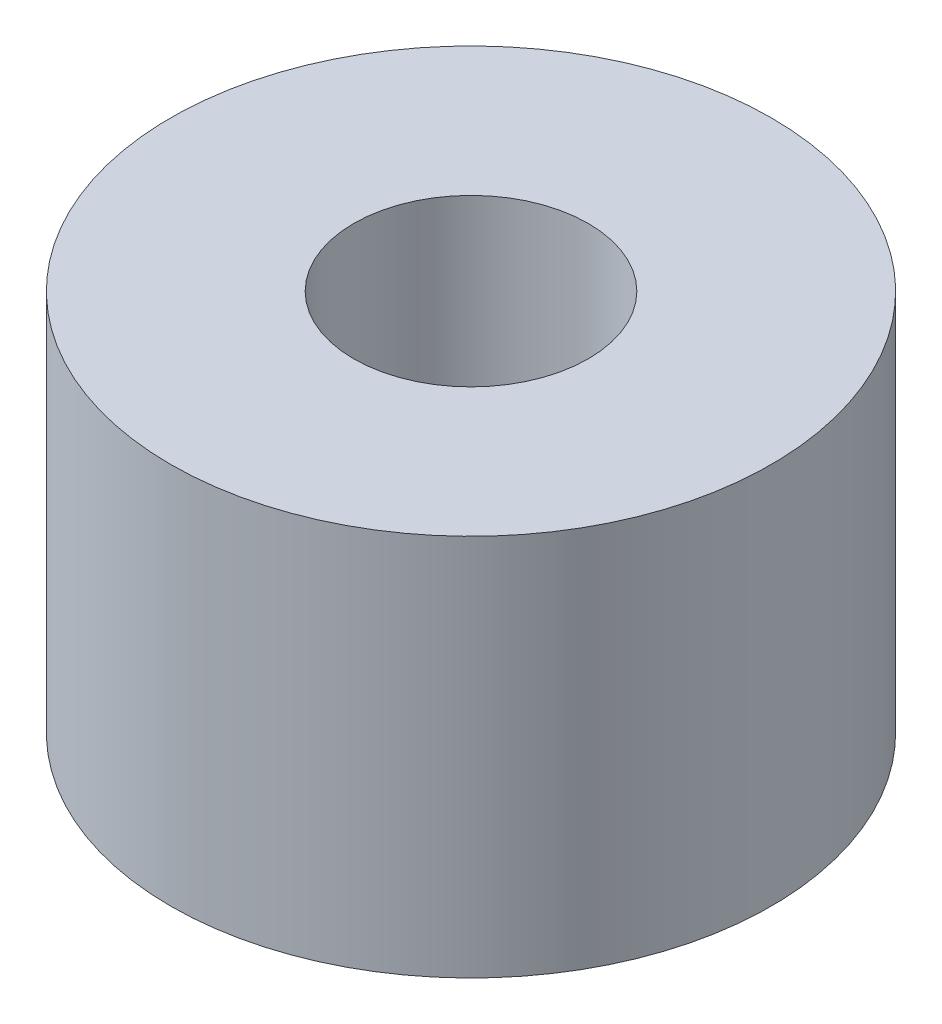
ISO-10303-21;
HEADER;
FILE_DESCRIPTION(('STEP AP214'),'2;1');
FILE_NAME('part.step','',(''),(''),'','','');
FILE_SCHEMA(('AUTOMOTIVE_DESIGN { 1 0 10303 214 1 1 1 1 }'));
ENDSEC;
DATA;
#1=APPLICATION_CONTEXT('core data for automotive mechanical design processes');
#2=APPLICATION_PROTOCOL_DEFINITION('international standard','automotive_design',2000,#1);
#3=PRODUCT_CONTEXT('',#1,'mechanical');
#4=PRODUCT('Part','Part','',(#3));
#5=PRODUCT_RELATED_PRODUCT_CATEGORY('part','',(#4));
#6=PRODUCT_DEFINITION_FORMATION('','',#4);
#7=PRODUCT_DEFINITION_CONTEXT('part definition',#1,'design');
#8=PRODUCT_DEFINITION('design','',#6,#7);
#9=PRODUCT_DEFINITION_SHAPE('','',#8);
#10=(LENGTH_UNIT() NAMED_UNIT(*) SI_UNIT(.MILLI.,.METRE.));
#11=(NAMED_UNIT(*) PLANE_ANGLE_UNIT() SI_UNIT($,.RADIAN.));
#12=(NAMED_UNIT(*) SI_UNIT($,.STERADIAN.) SOLID_ANGLE_UNIT());
#13=UNCERTAINTY_MEASURE_WITH_UNIT(LENGTH_MEASURE(1.E-05),#10,'distance_accuracy_value','');
#14=(GEOMETRIC_REPRESENTATION_CONTEXT(3) GLOBAL_UNCERTAINTY_ASSIGNED_CONTEXT((#13)) GLOBAL_UNIT_ASSIGNED_CONTEXT((#10,
#11,#12)) REPRESENTATION_CONTEXT('',''));
#15=CARTESIAN_POINT('',(0.,0.,0.));
#16=DIRECTION('',(0.,0.,1.));
#17=DIRECTION('',(1.,0.,0.));
#18=AXIS2_PLACEMENT_3D('',#15,#16,#17);
#19=CARTESIAN_POINT('',(0.,16.1798,0.));
#20=DIRECTION('',(0.,-1.,0.));
#21=DIRECTION('',(0.,0.,-1.));
#22=AXIS2_PLACEMENT_3D('',#19,#20,#21);
#23=CYLINDRICAL_SURFACE('',#22,12.7);
#24=CARTESIAN_POINT('',(0.,16.1798,0.));
#25=DIRECTION('',(0.,1.,0.));
#26=DIRECTION('',(0.,0.,1.));
#27=AXIS2_PLACEMENT_3D('',#24,#25,#26);
#28=CIRCLE('',#27,12.7);
#29=CARTESIAN_POINT('',(0.,16.1798,12.7));
#30=VERTEX_POINT('',#29);
#31=EDGE_CURVE('E13',#30,#30,#28,.T.);
#32=ORIENTED_EDGE('',*,*,#31,.F.);
#33=EDGE_LOOP('',(#32));
#34=FACE_BOUND('',#33,.T.);
#35=CARTESIAN_POINT('',(0.,0.,0.));
#36=DIRECTION('',(0.,1.,0.));
#37=DIRECTION('',(0.,0.,1.));
#38=AXIS2_PLACEMENT_3D('',#35,#36,#37);
#39=CIRCLE('',#38,12.7);
#40=CARTESIAN_POINT('',(0.,0.,12.7));
#41=VERTEX_POINT('',#40);
#42=EDGE_CURVE('E56',#41,#41,#39,.T.);
#43=ORIENTED_EDGE('',*,*,#42,.T.);
#44=EDGE_LOOP('',(#43));
#45=FACE_BOUND('',#44,.T.);
#46=ADVANCED_FACE('F53',(#34,#45),#23,.T.);
#47=CARTESIAN_POINT('',(0.,16.1798,0.));
#48=DIRECTION('',(0.,1.,0.));
#49=DIRECTION('',(0.,0.,1.));
#50=AXIS2_PLACEMENT_3D('',#47,#48,#49);
#51=PLANE('',#50);
#52=CARTESIAN_POINT('',(0.,16.1798,0.));
#53=DIRECTION('',(0.,1.,0.));
#54=DIRECTION('',(0.,0.,1.));
#55=AXIS2_PLACEMENT_3D('',#52,#53,#54);
#56=CIRCLE('',#55,4.96061999999999);
#57=CARTESIAN_POINT('',(0.,16.1798,4.96061999999999));
#58=VERTEX_POINT('',#57);
#59=EDGE_CURVE('E72',#58,#58,#56,.T.);
#60=ORIENTED_EDGE('',*,*,#59,.F.);
#61=EDGE_LOOP('',(#60));
#62=FACE_BOUND('',#61,.T.);
#63=ORIENTED_EDGE('',*,*,#31,.T.);
#64=EDGE_LOOP('',(#63));
#65=FACE_BOUND('',#64,.T.);
#66=ADVANCED_FACE('F80',(#62,#65),#51,.T.);
#67=CARTESIAN_POINT('',(0.,0.,0.));
#68=DIRECTION('',(0.,1.,0.));
#69=DIRECTION('',(0.,0.,1.));
#70=AXIS2_PLACEMENT_3D('',#67,#68,#69);
#71=PLANE('',#70);
#72=ORIENTED_EDGE('',*,*,#42,.F.);
#73=EDGE_LOOP('',(#72));
#74=FACE_BOUND('',#73,.T.);
#75=ADVANCED_FACE('F66',(#74),#71,.F.);
#76=CARTESIAN_POINT('',(0.,6.1556412039605,0.));
#77=DIRECTION('',(0.,1.,0.));
#78=DIRECTION('',(0.,0.,1.));
#79=AXIS2_PLACEMENT_3D('',#76,#77,#78);
#80=CONICAL_SURFACE('',#79,4.96062,1.02974425867665);
#81=CARTESIAN_POINT('',(0.,3.175,0.));
#82=VERTEX_POINT('',#81);
#83=VERTEX_LOOP('',#82);
#84=FACE_BOUND('',#83,.T.);
#85=CARTESIAN_POINT('',(0.,6.1556412039605,0.));
#86=DIRECTION('',(0.,1.,0.));
#87=DIRECTION('',(0.,0.,1.));
#88=AXIS2_PLACEMENT_3D('',#85,#86,#87);
#89=CIRCLE('',#88,4.96062);
#90=CARTESIAN_POINT('',(0.,6.1556412039605,4.96062));
#91=VERTEX_POINT('',#90);
#92=EDGE_CURVE('E70',#91,#91,#89,.T.);
#93=ORIENTED_EDGE('',*,*,#92,.T.);
#94=EDGE_LOOP('',(#93));
#95=FACE_BOUND('',#94,.T.);
#96=ADVANCED_FACE('F62',(#84,#95),#80,.F.);
#97=CARTESIAN_POINT('',(0.,16.1798,0.));
#98=DIRECTION('',(0.,1.,0.));
#99=DIRECTION('',(0.,0.,1.));
#100=AXIS2_PLACEMENT_3D('',#97,#98,#99);
#101=CYLINDRICAL_SURFACE('',#100,4.96061999999999);
#102=ORIENTED_EDGE('',*,*,#92,.F.);
#103=EDGE_LOOP('',(#102));
#104=FACE_BOUND('',#103,.T.);
#105=ORIENTED_EDGE('',*,*,#59,.T.);
#106=EDGE_LOOP('',(#105));
#107=FACE_BOUND('',#106,.T.);
#108=ADVANCED_FACE('F65',(#104,#107),#101,.F.);
#109=CLOSED_SHELL('',(#46,#66,#75,#96,#108));
#110=MANIFOLD_SOLID_BREP('B2',#109);
#111=ADVANCED_BREP_SHAPE_REPRESENTATION('',(#18,#110),#14);
#112=SHAPE_DEFINITION_REPRESENTATION(#9,#111);
ENDSEC;
END-ISO-10303-21;
